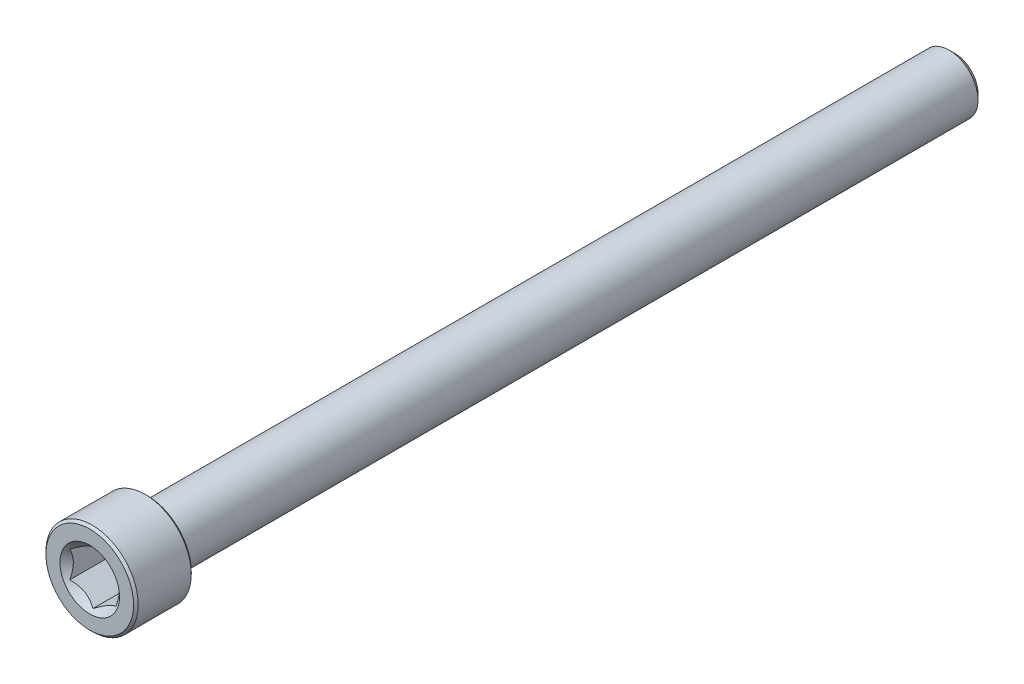
ISO-10303-21;
HEADER;
FILE_DESCRIPTION(('STEP AP214'),'2;1');
FILE_NAME('part.step','',(''),(''),'','','');
FILE_SCHEMA(('AUTOMOTIVE_DESIGN { 1 0 10303 214 1 1 1 1 }'));
ENDSEC;
DATA;
#1=APPLICATION_CONTEXT('core data for automotive mechanical design processes');
#2=APPLICATION_PROTOCOL_DEFINITION('international standard','automotive_design',2000,#1);
#3=PRODUCT_CONTEXT('',#1,'mechanical');
#4=PRODUCT('Part','Part','',(#3));
#5=PRODUCT_RELATED_PRODUCT_CATEGORY('part','',(#4));
#6=PRODUCT_DEFINITION_FORMATION('','',#4);
#7=PRODUCT_DEFINITION_CONTEXT('part definition',#1,'design');
#8=PRODUCT_DEFINITION('design','',#6,#7);
#9=PRODUCT_DEFINITION_SHAPE('','',#8);
#10=(LENGTH_UNIT() NAMED_UNIT(*) SI_UNIT(.MILLI.,.METRE.));
#11=(NAMED_UNIT(*) PLANE_ANGLE_UNIT() SI_UNIT($,.RADIAN.));
#12=(NAMED_UNIT(*) SI_UNIT($,.STERADIAN.) SOLID_ANGLE_UNIT());
#13=UNCERTAINTY_MEASURE_WITH_UNIT(LENGTH_MEASURE(1.E-05),#10,'distance_accuracy_value','');
#14=(GEOMETRIC_REPRESENTATION_CONTEXT(3) GLOBAL_UNCERTAINTY_ASSIGNED_CONTEXT((#13)) GLOBAL_UNIT_ASSIGNED_CONTEXT((#10,
#11,#12)) REPRESENTATION_CONTEXT('',''));
#15=CARTESIAN_POINT('',(0.,0.,0.));
#16=DIRECTION('',(0.,0.,1.));
#17=DIRECTION('',(1.,0.,0.));
#18=AXIS2_PLACEMENT_3D('',#15,#16,#17);
#19=CARTESIAN_POINT('',(2.,-1.154700538,-3.5));
#20=DIRECTION('',(1.,0.,0.));
#21=DIRECTION('',(0.,0.,1.));
#22=AXIS2_PLACEMENT_3D('',#19,#20,#21);
#23=PLANE('',#22);
#24=DIRECTION('',(0.,1.,0.));
#25=VECTOR('',#24,1.);
#26=CARTESIAN_POINT('',(2.,-2.309401077,-3.5));
#27=LINE('',#26,#25);
#28=CARTESIAN_POINT('',(2.,1.154700538,-3.5));
#29=VERTEX_POINT('',#28);
#30=CARTESIAN_POINT('',(2.,-1.15470053794893,-3.5));
#31=VERTEX_POINT('',#30);
#32=EDGE_CURVE('E159',#29,#31,#27,.F.);
#33=ORIENTED_EDGE('',*,*,#32,.T.);
#34=DIRECTION('',(0.,0.,1.));
#35=VECTOR('',#34,1.);
#36=CARTESIAN_POINT('',(2.,-1.1547005382376,-3.5));
#37=LINE('',#36,#35);
#38=CARTESIAN_POINT('',(2.00000000308098,-1.15470052267029,-0.269514051372486));
#39=VERTEX_POINT('',#38);
#40=EDGE_CURVE('E158',#39,#31,#37,.F.);
#41=ORIENTED_EDGE('',*,*,#40,.F.);
#42=CARTESIAN_POINT('',(2.,-1.15470051123793,-0.269514059670483));
#43=CARTESIAN_POINT('',(2.,-1.09141316260689,-0.300813622664889));
#44=CARTESIAN_POINT('',(2.,-1.02732561361497,-0.330613972957736));
#45=CARTESIAN_POINT('',(2.,-0.897288848890588,-0.386428363756532));
#46=CARTESIAN_POINT('',(2.,-0.831334343991557,-0.412430015535758));
#47=CARTESIAN_POINT('',(2.,-0.697433761794185,-0.459744148167775));
#48=CARTESIAN_POINT('',(2.00000000000001,-0.629480671385323,-0.481037113580133));
#49=CARTESIAN_POINT('',(1.99999999999999,-0.492081590441734,-0.517743621901352));
#50=CARTESIAN_POINT('',(1.99999999999997,-0.422637934909225,-0.533165739549636));
#51=CARTESIAN_POINT('',(1.99999999999997,-0.294338226574925,-0.555212898866587));
#52=CARTESIAN_POINT('',(1.99999999999999,-0.23566206566693,-0.562880186848599));
#53=CARTESIAN_POINT('',(2.00000000000001,-0.117989875900202,-0.573131677915132));
#54=CARTESIAN_POINT('',(2.,-0.0589948452951878,-0.575727118674964));
#55=CARTESIAN_POINT('',(2.,0.0590319978364044,-0.575727252211933));
#56=CARTESIAN_POINT('',(2.,0.118063810128711,-0.573128674928614));
#57=CARTESIAN_POINT('',(2.,0.23570432489238,-0.562873057258418));
#58=CARTESIAN_POINT('',(2.,0.294312839778573,-0.555213898490034));
#59=CARTESIAN_POINT('',(2.,0.410988060849133,-0.53517104010364));
#60=CARTESIAN_POINT('',(2.,0.46905095430725,-0.522765425585117));
#61=CARTESIAN_POINT('',(2.,0.58412672149976,-0.493768734727346));
#62=CARTESIAN_POINT('',(2.00000000000002,0.641139227564307,-0.477176221620323));
#63=CARTESIAN_POINT('',(2.00000000000002,0.776392762923852,-0.433094045798371));
#64=CARTESIAN_POINT('',(2.,0.854076447153317,-0.403893285807865));
#65=CARTESIAN_POINT('',(2.,0.968491928413275,-0.356123559122395));
#66=CARTESIAN_POINT('',(2.,1.00611484294823,-0.339621547608831));
#67=CARTESIAN_POINT('',(2.,1.08081059546299,-0.305424807709915));
#68=CARTESIAN_POINT('',(2.,1.11788349294676,-0.287730209510482));
#69=CARTESIAN_POINT('',(2.,1.15470054563611,-0.269514042648603));
#70=B_SPLINE_CURVE_WITH_KNOTS('',3,(#42,#43,#44,#45,#46,#47,#48,#49,#50,#51,#52,#53,#54,#55,#56,
#57,#58,#59,#60,#61,#62,#63,#64,#65,#66,#67,#68,#69),.UNSPECIFIED.,.F.,.F.,(4,2,2,2,2,2,2,2,2,2,
2,2,2,4),(0.,0.211871833424148,0.424419918805575,0.637833066220586,0.850933303443512,
1.02825559646968,1.20518454958216,1.38222492907141,1.55933946542912,1.73728182449737,
1.91528532914889,2.16395166893227,2.28718551539448,2.41040593104449),.UNSPECIFIED.);
#71=CARTESIAN_POINT('',(2.,1.15470054181806,-0.269514053601867));
#72=VERTEX_POINT('',#71);
#73=EDGE_CURVE('E58',#39,#72,#70,.T.);
#74=ORIENTED_EDGE('',*,*,#73,.T.);
#75=DIRECTION('',(0.,0.,1.));
#76=VECTOR('',#75,1.);
#77=CARTESIAN_POINT('',(2.,1.154700538,-3.5));
#78=LINE('',#77,#76);
#79=EDGE_CURVE('E145',#29,#72,#78,.T.);
#80=ORIENTED_EDGE('',*,*,#79,.F.);
#81=EDGE_LOOP('',(#33,#41,#74,#80));
#82=FACE_BOUND('',#81,.T.);
#83=ADVANCED_FACE('F53',(#82),#23,.F.);
#84=CARTESIAN_POINT('',(0.,-2.309401077,-0.250131148));
#85=DIRECTION('',(0.50000000031193,-0.866025403604346,0.));
#86=DIRECTION('',(0.866025403604346,0.50000000031193,0.));
#87=AXIS2_PLACEMENT_3D('',#84,#85,#86);
#88=PLANE('',#87);
#89=DIRECTION('',(-0.866025403604346,-0.50000000031193,0.));
#90=VECTOR('',#89,1.);
#91=CARTESIAN_POINT('',(1.99999999963638,-1.15470053787019,-3.5));
#92=LINE('',#91,#90);
#93=CARTESIAN_POINT('',(-4.70671904957264E-10,-2.30940107727174,-3.5));
#94=VERTEX_POINT('',#93);
#95=EDGE_CURVE('E146',#31,#94,#92,.T.);
#96=ORIENTED_EDGE('',*,*,#95,.T.);
#97=DIRECTION('',(0.,0.,-1.));
#98=VECTOR('',#97,1.);
#99=CARTESIAN_POINT('',(-6.47114344191555E-10,-2.30940107737361,-0.250131148));
#100=LINE('',#99,#98);
#101=CARTESIAN_POINT('',(1.4680532466432E-08,-2.30940107211196,-0.26951405083831));
#102=VERTEX_POINT('',#101);
#103=EDGE_CURVE('E193',#102,#94,#100,.T.);
#104=ORIENTED_EDGE('',*,*,#103,.F.);
#105=CARTESIAN_POINT('',(2.34410859076419E-08,-2.30940106346628,-0.26951405939491));
#106=CARTESIAN_POINT('',(0.0366667818223353,-2.28823150062695,-0.290461396144568));
#107=CARTESIAN_POINT('',(0.0736365423483632,-2.26688699941762,-0.310725715212649));
#108=CARTESIAN_POINT('',(0.148312433981132,-2.2237728532456,-0.349699316018672));
#109=CARTESIAN_POINT('',(0.186020376147532,-2.20200216266713,-0.36840396089146));
#110=CARTESIAN_POINT('',(0.262127072597705,-2.15806194094794,-0.403962117807034));
#111=CARTESIAN_POINT('',(0.300526423703779,-2.1358920652317,-0.420813931619529));
#112=CARTESIAN_POINT('',(0.397111609404862,-2.08012858222107,-0.460155148257436));
#113=CARTESIAN_POINT('',(0.455709741496556,-2.04629693485578,-0.481322288691599));
#114=CARTESIAN_POINT('',(0.574247774519945,-1.97785896952358,-0.517846630490531));
#115=CARTESIAN_POINT('',(0.634187151661863,-1.94325295396682,-0.533206059374245));
#116=CARTESIAN_POINT('',(0.746735494892844,-1.87827313765152,-0.555538144460678));
#117=CARTESIAN_POINT('',(0.799214788073673,-1.84797420358151,-0.563375573125499));
#118=CARTESIAN_POINT('',(0.904581401219032,-1.78714076106785,-0.573633038578399));
#119=CARTESIAN_POINT('',(0.957468756106172,-1.75660623246163,-0.576052606418792));
#120=CARTESIAN_POINT('',(1.06321795639198,-1.69555190315924,-0.575331177017809));
#121=CARTESIAN_POINT('',(1.11607979988058,-1.66503210356585,-0.572189813442251));
#122=CARTESIAN_POINT('',(1.22134434538901,-1.60425758982988,-0.560528571092439));
#123=CARTESIAN_POINT('',(1.2737470803736,-1.57400285665508,-0.552009081739217));
#124=CARTESIAN_POINT('',(1.38438824615751,-1.51012414975315,-0.528638999079536));
#125=CARTESIAN_POINT('',(1.44251987278194,-1.4765618394452,-0.513120247302543));
#126=CARTESIAN_POINT('',(1.55755500840878,-1.41014627286953,-0.476661296370748));
#127=CARTESIAN_POINT('',(1.61445677974814,-1.37729401984206,-0.45571390854881));
#128=CARTESIAN_POINT('',(1.72700816186304,-1.3123124490263,-0.4092740393445));
#129=CARTESIAN_POINT('',(1.78265384568009,-1.28018539846856,-0.383769067010784));
#130=CARTESIAN_POINT('',(1.89241626832334,-1.21681403415587,-0.329149843411634));
#131=CARTESIAN_POINT('',(1.94653697086662,-1.18556743194778,-0.300046266565295));
#132=CARTESIAN_POINT('',(2.00000000616196,-1.15470053410264,-0.269514043074489));
#133=B_SPLINE_CURVE_WITH_KNOTS('',3,(#105,#106,#107,#108,#109,#110,#111,#112,#113,#114,#115,
#116,#117,#118,#119,#120,#121,#122,#123,#124,#125,#126,#127,#128,#129,#130,#131,#132),
.UNSPECIFIED.,.F.,.F.,(4,2,2,2,2,2,2,2,2,2,2,2,2,4),(0.,0.141723316810714,0.283853972472535,
0.426113832082238,0.638582605696147,0.850969805105824,1.03405254816131,1.21715113749136,
1.40026178914749,1.5833591835902,1.7897767440648,1.99646905448806,2.20373678542241,
2.41040382536164),.UNSPECIFIED.);
#134=EDGE_CURVE('E160',#102,#39,#133,.T.);
#135=ORIENTED_EDGE('',*,*,#134,.T.);
#136=ORIENTED_EDGE('',*,*,#40,.T.);
#137=EDGE_LOOP('',(#96,#104,#135,#136));
#138=FACE_BOUND('',#137,.T.);
#139=ADVANCED_FACE('F173',(#138),#88,.F.);
#140=CARTESIAN_POINT('',(2.,1.154700538,-0.250131148));
#141=DIRECTION('',(0.50000000031193,0.866025403604346,0.));
#142=DIRECTION('',(-0.866025403604346,0.50000000031193,0.));
#143=AXIS2_PLACEMENT_3D('',#140,#141,#142);
#144=PLANE('',#143);
#145=DIRECTION('',(-0.866025403604346,0.50000000031193,0.));
#146=VECTOR('',#145,1.);
#147=CARTESIAN_POINT('',(2.,1.154700538,-3.5));
#148=LINE('',#147,#146);
#149=CARTESIAN_POINT('',(2.20671571293796E-10,2.30940107721234,-3.5));
#150=VERTEX_POINT('',#149);
#151=EDGE_CURVE('E151',#29,#150,#148,.T.);
#152=ORIENTED_EDGE('',*,*,#151,.F.);
#153=ORIENTED_EDGE('',*,*,#79,.T.);
#154=CARTESIAN_POINT('',(1.99999997655074,1.15470055153844,-0.269514059826263));
#155=CARTESIAN_POINT('',(1.96333321815987,1.17587011438333,-0.290461396560443));
#156=CARTESIAN_POINT('',(1.92636345762391,1.19721461559839,-0.310725715611674));
#157=CARTESIAN_POINT('',(1.85168756597079,1.24032876178216,-0.349699316381127));
#158=CARTESIAN_POINT('',(1.81397962379396,1.26209945236665,-0.368403961234182));
#159=CARTESIAN_POINT('',(1.73787292732279,1.30603967409796,-0.403962118107244));
#160=CARTESIAN_POINT('',(1.69947357620615,1.3282095498203,-0.420813931896956));
#161=CARTESIAN_POINT('',(1.60288839048328,1.38397303284352,-0.460155148471805));
#162=CARTESIAN_POINT('',(1.54429025838055,1.41780468021519,-0.481322288863874));
#163=CARTESIAN_POINT('',(1.42575222533703,1.48624264555898,-0.517846630571726));
#164=CARTESIAN_POINT('',(1.36581284818602,1.52084866112094,-0.533206059406455));
#165=CARTESIAN_POINT('',(1.25326450493319,1.58582847744886,-0.555538144398408));
#166=CARTESIAN_POINT('',(1.200785211739,1.61612741152663,-0.56337557301761));
#167=CARTESIAN_POINT('',(1.09541859857039,1.67696085405375,-0.573633038375843));
#168=CARTESIAN_POINT('',(1.04253124367336,1.70749538266566,-0.576052606167185));
#169=CARTESIAN_POINT('',(0.936782043370094,1.76854971197813,-0.57533117666743));
#170=CARTESIAN_POINT('',(0.883920199873925,1.79906951157589,-0.572189813041979));
#171=CARTESIAN_POINT('',(0.778655654353936,1.85984402531853,-0.560528570594069));
#172=CARTESIAN_POINT('',(0.726252919365357,1.89009875849562,-0.552009081192639));
#173=CARTESIAN_POINT('',(0.615611753599515,1.95397746538712,-0.528638998439564));
#174=CARTESIAN_POINT('',(0.55748012699711,1.98753977568237,-0.513120246620448));
#175=CARTESIAN_POINT('',(0.442444991415202,2.0539553422321,-0.476661295614484));
#176=CARTESIAN_POINT('',(0.385543220098744,2.08680759524635,-0.455713907760529));
#177=CARTESIAN_POINT('',(0.272991838033529,2.15178916603341,-0.409274038503187));
#178=CARTESIAN_POINT('',(0.217346154243124,2.18391621657577,-0.383769066148842));
#179=CARTESIAN_POINT('',(0.107583731651272,2.24728758085879,-0.329149842516337));
#180=CARTESIAN_POINT('',(0.0534630291327461,2.27853418305259,-0.300046265657223));
#181=CARTESIAN_POINT('',(-6.1388418220315E-09,2.30940108088401,-0.269514042156649));
#182=B_SPLINE_CURVE_WITH_KNOTS('',3,(#154,#155,#156,#157,#158,#159,#160,#161,#162,#163,#164,
#165,#166,#167,#168,#169,#170,#171,#172,#173,#174,#175,#176,#177,#178,#179,#180,#181),
.UNSPECIFIED.,.F.,.F.,(4,2,2,2,2,2,2,2,2,2,2,2,2,4),(0.,0.141723316819992,0.28385397249154,
0.426113832111052,0.638582605723244,0.850969805131258,1.03405254821484,1.21715113757313,
1.40026178926321,1.58335918373999,1.78977674416957,1.99646905454705,2.2037367854189,
2.41040382529713),.UNSPECIFIED.);
#183=CARTESIAN_POINT('',(-2.99586443435092E-09,2.30940107906941,-0.26951405335589));
#184=VERTEX_POINT('',#183);
#185=EDGE_CURVE('E133',#72,#184,#182,.T.);
#186=ORIENTED_EDGE('',*,*,#185,.T.);
#187=DIRECTION('',(0.,0.,-1.));
#188=VECTOR('',#187,1.);
#189=CARTESIAN_POINT('',(1.4711452542282E-10,2.30940107725481,-0.250131148));
#190=LINE('',#189,#188);
#191=EDGE_CURVE('E206',#150,#184,#190,.F.);
#192=ORIENTED_EDGE('',*,*,#191,.F.);
#193=EDGE_LOOP('',(#152,#153,#186,#192));
#194=FACE_BOUND('',#193,.T.);
#195=ADVANCED_FACE('F149',(#194),#144,.F.);
#196=CARTESIAN_POINT('',(-2.000000006,-1.154700535,-0.250131127));
#197=DIRECTION('',(-0.500000000161208,-0.866025403691365,0.));
#198=DIRECTION('',(0.866025403691365,-0.500000000161208,0.));
#199=AXIS2_PLACEMENT_3D('',#196,#197,#198);
#200=PLANE('',#199);
#201=DIRECTION('',(0.866025403691365,-0.500000000161208,0.));
#202=VECTOR('',#201,1.);
#203=CARTESIAN_POINT('',(-2.000000006,-1.154700535,-3.5));
#204=LINE('',#203,#202);
#205=CARTESIAN_POINT('',(-2.00000000010048,-1.15470053840609,-3.5));
#206=VERTEX_POINT('',#205);
#207=EDGE_CURVE('E202',#206,#94,#204,.T.);
#208=ORIENTED_EDGE('',*,*,#207,.F.);
#209=DIRECTION('',(0.,0.,-1.));
#210=VECTOR('',#209,1.);
#211=CARTESIAN_POINT('',(-2.00000000020096,-1.15470053834808,-0.250131127));
#212=LINE('',#211,#210);
#213=CARTESIAN_POINT('',(-2.00000000394818,-1.15470053618462,-0.269514042740437));
#214=VERTEX_POINT('',#213);
#215=EDGE_CURVE('E201',#214,#206,#212,.T.);
#216=ORIENTED_EDGE('',*,*,#215,.F.);
#217=CARTESIAN_POINT('',(-2.00000000769541,-1.15470053402116,-0.269514041800493));
#218=CARTESIAN_POINT('',(-1.9633332495226,-1.17587009673164,-0.290461378897032));
#219=CARTESIAN_POINT('',(-1.9263634892119,-1.19721459780807,-0.310725698341832));
#220=CARTESIAN_POINT('',(-1.85168759802394,-1.24032874370595,-0.349699299969472));
#221=CARTESIAN_POINT('',(-1.81397965608712,-1.26209943414312,-0.368403945287519));
#222=CARTESIAN_POINT('',(-1.73787296010314,-1.30603965557549,-0.403962103172786));
#223=CARTESIAN_POINT('',(-1.69947360923369,-1.3282095311462,-0.420813917509831));
#224=CARTESIAN_POINT('',(-1.60288842403816,-1.38397301384255,-0.46015513559925));
#225=CARTESIAN_POINT('',(-1.54429029221302,-1.41780466104035,-0.481322277007332));
#226=CARTESIAN_POINT('',(-1.42575225968184,-1.48624262606084,-0.517846620941812));
#227=CARTESIAN_POINT('',(-1.36581288276558,-1.52084864147336,-0.533206050987076));
#228=CARTESIAN_POINT('',(-1.25326453988715,-1.585828457559,-0.55553813837825));
#229=CARTESIAN_POINT('',(-1.20078524684429,-1.61612739153722,-0.563375568167468));
#230=CARTESIAN_POINT('',(-1.09541863388945,-1.67696083391647,-0.573633035936899));
#231=CARTESIAN_POINT('',(-1.04253127905485,-1.70749536248007,-0.576052604969535));
#232=CARTESIAN_POINT('',(-0.936782078804225,-1.7685496917376,-0.575331177953416));
#233=CARTESIAN_POINT('',(-0.883920235298245,-1.79906949132876,-0.5721898155732));
#234=CARTESIAN_POINT('',(-0.778655689670982,-1.85984400510891,-0.560528575552718));
#235=CARTESIAN_POINT('',(-0.726252954584936,-1.89009873833012,-0.552009087333614));
#236=CARTESIAN_POINT('',(-0.615611785657401,-1.95397744702134,-0.528639006364149));
#237=CARTESIAN_POINT('',(-0.557480156031052,-1.98753975904898,-0.513120254822423));
#238=CARTESIAN_POINT('',(-0.44244501448489,-2.05395532901547,-0.476661303705195));
#239=CARTESIAN_POINT('',(-0.385543240228545,-2.08680758371386,-0.455713915460509));
#240=CARTESIAN_POINT('',(-0.272991852293287,-2.15178915786389,-0.40927404484587));
#241=CARTESIAN_POINT('',(-0.217346165576066,-2.18391621008313,-0.383769071514073));
#242=CARTESIAN_POINT('',(-0.107583737305808,-2.24728757761911,-0.329149845527793));
#243=CARTESIAN_POINT('',(-0.0534630320346568,-2.27853418138957,-0.300046267295246));
#244=CARTESIAN_POINT('',(5.91997696523794E-09,-2.30940108075765,-0.269514042281709));
#245=B_SPLINE_CURVE_WITH_KNOTS('',3,(#217,#218,#219,#220,#221,#222,#223,#224,#225,#226,#227,
#228,#229,#230,#231,#232,#233,#234,#235,#236,#237,#238,#239,#240,#241,#242,#243,#244),
.UNSPECIFIED.,.F.,.F.,(4,2,2,2,2,2,2,2,2,2,2,2,2,4),(0.,0.141723316612889,0.283853972061864,
0.426113831455091,0.638582605054632,0.850969804450178,1.0340525474533,1.21715113672758,
1.40026178823836,1.58335918253144,1.78977675290602,1.99646907328744,2.20373681462456,
2.41040386484257),.UNSPECIFIED.);
#246=EDGE_CURVE('E155',#214,#102,#245,.T.);
#247=ORIENTED_EDGE('',*,*,#246,.T.);
#248=ORIENTED_EDGE('',*,*,#103,.T.);
#249=EDGE_LOOP('',(#208,#216,#247,#248));
#250=FACE_BOUND('',#249,.T.);
#251=ADVANCED_FACE('F182',(#250),#200,.F.);
#252=CARTESIAN_POINT('',(-2.,-2.309401077,-3.5));
#253=DIRECTION('',(0.,0.,-1.));
#254=DIRECTION('',(1.,0.,0.));
#255=AXIS2_PLACEMENT_3D('',#252,#253,#254);
#256=PLANE('',#255);
#257=DIRECTION('',(0.866025403604346,0.50000000031193,0.));
#258=VECTOR('',#257,1.);
#259=CARTESIAN_POINT('',(-2.000000015,1.154700529,-3.5));
#260=LINE('',#259,#258);
#261=CARTESIAN_POINT('',(-1.99999999992644,1.15470053770272,-3.5));
#262=VERTEX_POINT('',#261);
#263=EDGE_CURVE('E210',#262,#150,#260,.T.);
#264=ORIENTED_EDGE('',*,*,#263,.F.);
#265=DIRECTION('',(0.,1.,0.));
#266=VECTOR('',#265,1.);
#267=CARTESIAN_POINT('',(-2.,-2.309401077,-3.5));
#268=LINE('',#267,#266);
#269=EDGE_CURVE('E205',#206,#262,#268,.T.);
#270=ORIENTED_EDGE('',*,*,#269,.F.);
#271=ORIENTED_EDGE('',*,*,#207,.T.);
#272=ORIENTED_EDGE('',*,*,#95,.F.);
#273=ORIENTED_EDGE('',*,*,#32,.F.);
#274=ORIENTED_EDGE('',*,*,#151,.T.);
#275=EDGE_LOOP('',(#264,#270,#271,#272,#273,#274));
#276=FACE_BOUND('',#275,.T.);
#277=ADVANCED_FACE('F227',(#276),#256,.F.);
#278=CARTESIAN_POINT('',(0.,2.309401077,-0.250131148));
#279=DIRECTION('',(-0.50000000031193,0.866025403604346,0.));
#280=DIRECTION('',(-0.866025403604346,-0.50000000031193,0.));
#281=AXIS2_PLACEMENT_3D('',#278,#279,#280);
#282=PLANE('',#281);
#283=ORIENTED_EDGE('',*,*,#263,.T.);
#284=ORIENTED_EDGE('',*,*,#191,.T.);
#285=CARTESIAN_POINT('',(-2.36027140998086E-08,2.30940106337297,-0.269514059487264));
#286=CARTESIAN_POINT('',(-0.0366667819851753,2.28823150053293,-0.290461396235029));
#287=CARTESIAN_POINT('',(-0.0736365425124397,2.26688699932289,-0.310725715301092));
#288=CARTESIAN_POINT('',(-0.148312434147754,2.2237728531494,-0.349699316102727));
#289=CARTESIAN_POINT('',(-0.186020376315464,2.20200216257018,-0.368403960973143));
#290=CARTESIAN_POINT('',(-0.262127072768308,2.15806194084944,-0.403962117883501));
#291=CARTESIAN_POINT('',(-0.300526423875744,2.13589206513242,-0.420813931693152));
#292=CARTESIAN_POINT('',(-0.39711160957959,2.08012858212019,-0.460155148323199));
#293=CARTESIAN_POINT('',(-0.455709741672657,2.04629693475411,-0.481322288752139));
#294=CARTESIAN_POINT('',(-0.574247774698599,1.97785896942043,-0.517846630539498));
#295=CARTESIAN_POINT('',(-0.634187151841696,1.94325295386299,-0.533206059416862));
#296=CARTESIAN_POINT('',(-0.74673549507459,1.87827313754659,-0.555538144490762));
#297=CARTESIAN_POINT('',(-0.799214788256216,1.84797420347612,-0.563375573149487));
#298=CARTESIAN_POINT('',(-0.904581401402707,1.7871407609618,-0.573633038589895));
#299=CARTESIAN_POINT('',(-0.957468756290181,1.75660623235539,-0.576052606423893));
#300=CARTESIAN_POINT('',(-1.06321795657637,1.69555190305278,-0.575331177010083));
#301=CARTESIAN_POINT('',(-1.11607980006501,1.66503210345937,-0.572189813428072));
#302=CARTESIAN_POINT('',(-1.22134434557307,1.60425758972361,-0.560528571065701));
#303=CARTESIAN_POINT('',(-1.27374708055725,1.57400285654906,-0.552009081706375));
#304=CARTESIAN_POINT('',(-1.38438824633938,1.51012414964816,-0.528638999034415));
#305=CARTESIAN_POINT('',(-1.44251987296239,1.47656183934101,-0.513120247251383));
#306=CARTESIAN_POINT('',(-1.55755500858622,1.41014627276709,-0.476661296308504));
#307=CARTESIAN_POINT('',(-1.61445677992398,1.37729401974054,-0.455713908481522));
#308=CARTESIAN_POINT('',(-1.72700816203507,1.31231244892698,-0.409274039268296));
#309=CARTESIAN_POINT('',(-1.78265384584995,1.28018539837049,-0.383769066930757));
#310=CARTESIAN_POINT('',(-1.89241626848897,1.21681403406024,-0.329149843324834));
#311=CARTESIAN_POINT('',(-1.9465369710302,1.18556743185334,-0.300046266475541));
#312=CARTESIAN_POINT('',(-2.00000000632359,1.15470053400933,-0.269514042982134));
#313=B_SPLINE_CURVE_WITH_KNOTS('',3,(#285,#286,#287,#288,#289,#290,#291,#292,#293,#294,#295,
#296,#297,#298,#299,#300,#301,#302,#303,#304,#305,#306,#307,#308,#309,#310,#311,#312),
.UNSPECIFIED.,.F.,.F.,(4,2,2,2,2,2,2,2,2,2,2,2,2,4),(0.,0.141723316811969,0.283853972475134,
0.426113832086201,0.638582605699897,0.850969805109349,1.0340525481652,1.21715113749563,
1.40026178915291,1.58335918359679,1.78977674407081,1.99646905449342,2.20373678542504,
2.41040382536165),.UNSPECIFIED.);
#314=CARTESIAN_POINT('',(-2.00000000308824,1.15470053587726,-0.269514053080863));
#315=VERTEX_POINT('',#314);
#316=EDGE_CURVE('E141',#184,#315,#313,.T.);
#317=ORIENTED_EDGE('',*,*,#316,.T.);
#318=DIRECTION('',(0.,0.,-1.));
#319=VECTOR('',#318,1.);
#320=CARTESIAN_POINT('',(-1.99999999985289,1.15470053774519,-0.250131148));
#321=LINE('',#320,#319);
#322=EDGE_CURVE('E208',#262,#315,#321,.F.);
#323=ORIENTED_EDGE('',*,*,#322,.F.);
#324=EDGE_LOOP('',(#283,#284,#317,#323));
#325=FACE_BOUND('',#324,.T.);
#326=ADVANCED_FACE('F222',(#325),#282,.F.);
#327=CARTESIAN_POINT('',(-2.,1.154700538,-0.250131127));
#328=DIRECTION('',(-1.,0.,0.));
#329=DIRECTION('',(0.,-1.,0.));
#330=AXIS2_PLACEMENT_3D('',#327,#328,#329);
#331=PLANE('',#330);
#332=ORIENTED_EDGE('',*,*,#269,.T.);
#333=ORIENTED_EDGE('',*,*,#322,.T.);
#334=CARTESIAN_POINT('',(-2.,1.1547005109852,-0.269514059795543));
#335=CARTESIAN_POINT('',(-2.,1.09141316234718,-0.300813622788192));
#336=CARTESIAN_POINT('',(-2.,1.02732561334804,-0.330613973078675));
#337=CARTESIAN_POINT('',(-2.,0.897288848608815,-0.386428363870992));
#338=CARTESIAN_POINT('',(-2.,0.831334343702156,-0.412430015646095));
#339=CARTESIAN_POINT('',(-2.,0.697433761498961,-0.459744148264097));
#340=CARTESIAN_POINT('',(-2.00000000000001,0.629480671092152,-0.481037113667253));
#341=CARTESIAN_POINT('',(-1.99999999999999,0.492081590153311,-0.517743621969554));
#342=CARTESIAN_POINT('',(-1.99999999999997,0.422637934623495,-0.533165739608122));
#343=CARTESIAN_POINT('',(-1.99999999999997,0.294338226217761,-0.555212898920149));
#344=CARTESIAN_POINT('',(-1.99999999999999,0.235662065234454,-0.56288018690081));
#345=CARTESIAN_POINT('',(-2.00000000000001,0.117989875312741,-0.573131677951624));
#346=CARTESIAN_POINT('',(-2.,0.0589948446280198,-0.575727118696725));
#347=CARTESIAN_POINT('',(-2.,-0.0590319986024294,-0.575727252190158));
#348=CARTESIAN_POINT('',(-2.,-0.118063810913885,-0.573128674883185));
#349=CARTESIAN_POINT('',(-2.,-0.235704325713886,-0.562873057163553));
#350=CARTESIAN_POINT('',(-2.,-0.294312840617258,-0.555213898369371));
#351=CARTESIAN_POINT('',(-2.,-0.410988061705339,-0.535171039932846));
#352=CARTESIAN_POINT('',(-2.,-0.469050955163994,-0.522765425391171));
#353=CARTESIAN_POINT('',(-2.,-0.58412672235625,-0.493768734489385));
#354=CARTESIAN_POINT('',(-2.00000000000002,-0.641139228420022,-0.477176221361558));
#355=CARTESIAN_POINT('',(-2.00000000000002,-0.776392758038312,-0.433094047362535));
#356=CARTESIAN_POINT('',(-2.,-0.854076436692495,-0.403893289727786));
#357=CARTESIAN_POINT('',(-2.,-0.968491909892792,-0.356123567076752));
#358=CARTESIAN_POINT('',(-2.,-1.00611482181393,-0.339621556978416));
#359=CARTESIAN_POINT('',(-2.,-1.08081056917859,-0.305424820048441));
#360=CARTESIAN_POINT('',(-2.,-1.11788346412602,-0.287730223402595));
#361=CARTESIAN_POINT('',(-2.,-1.15470051431106,-0.269514058149751));
#362=B_SPLINE_CURVE_WITH_KNOTS('',3,(#334,#335,#336,#337,#338,#339,#340,#341,#342,#343,#344,
#345,#346,#347,#348,#349,#350,#351,#352,#353,#354,#355,#356,#357,#358,#359,#360,#361),
.UNSPECIFIED.,.F.,.F.,(4,2,2,2,2,2,2,2,2,2,2,2,2,4),(0.,0.211871833440665,0.424419918838733,
0.637833066239533,0.850933303448268,1.02825559669709,1.20518455004553,1.38222492959516,
1.55933946601383,1.73728182509864,1.91528532976428,2.16395165147123,2.2871854890489,
2.41040589582687),.UNSPECIFIED.);
#363=EDGE_CURVE('E196',#315,#214,#362,.T.);
#364=ORIENTED_EDGE('',*,*,#363,.T.);
#365=ORIENTED_EDGE('',*,*,#215,.T.);
#366=EDGE_LOOP('',(#332,#333,#364,#365));
#367=FACE_BOUND('',#366,.T.);
#368=ADVANCED_FACE('F226',(#367),#331,.F.);
#369=CARTESIAN_POINT('',(-1.983860223,0.,-0.591700665));
#370=CARTESIAN_POINT('',(-2.581720992,0.,0.));
#371=(BOUNDED_CURVE() B_SPLINE_CURVE(1,(#369,#370),.UNSPECIFIED.,.F.,
.F.) B_SPLINE_CURVE_WITH_KNOTS((2,2),(0.,1.),
.UNSPECIFIED.) CURVE() GEOMETRIC_REPRESENTATION_ITEM() RATIONAL_B_SPLINE_CURVE((1.,1.)) REPRESENTATION_ITEM(''));
#372=CARTESIAN_POINT('',(0.,0.,-1000.));
#373=DIRECTION('',(0.,0.,1.));
#374=AXIS1_PLACEMENT('',#372,#373);
#375=SURFACE_OF_REVOLUTION('',#371,#374);
#376=ORIENTED_EDGE('',*,*,#134,.F.);
#377=ORIENTED_EDGE('',*,*,#246,.F.);
#378=ORIENTED_EDGE('',*,*,#363,.F.);
#379=ORIENTED_EDGE('',*,*,#316,.F.);
#380=ORIENTED_EDGE('',*,*,#185,.F.);
#381=ORIENTED_EDGE('',*,*,#73,.F.);
#382=EDGE_LOOP('',(#376,#377,#378,#379,#380,#381));
#383=FACE_BOUND('',#382,.T.);
#384=CARTESIAN_POINT('',(0.,0.,0.));
#385=DIRECTION('',(0.,0.,-1.));
#386=DIRECTION('',(-1.,0.,0.));
#387=AXIS2_PLACEMENT_3D('',#384,#385,#386);
#388=CIRCLE('',#387,2.581720992);
#389=CARTESIAN_POINT('',(-2.581720992,0.,0.));
#390=VERTEX_POINT('',#389);
#391=EDGE_CURVE('E239',#390,#390,#388,.F.);
#392=ORIENTED_EDGE('',*,*,#391,.T.);
#393=EDGE_LOOP('',(#392));
#394=FACE_BOUND('',#393,.T.);
#395=ADVANCED_FACE('F136',(#383,#394),#375,.F.);
#396=CARTESIAN_POINT('',(3.8456,-3.8456,0.));
#397=DIRECTION('',(0.,0.,1.));
#398=DIRECTION('',(-1.,0.,0.));
#399=AXIS2_PLACEMENT_3D('',#396,#397,#398);
#400=PLANE('',#399);
#401=ORIENTED_EDGE('',*,*,#391,.F.);
#402=EDGE_LOOP('',(#401));
#403=FACE_BOUND('',#402,.T.);
#404=CARTESIAN_POINT('',(0.,0.,0.));
#405=DIRECTION('',(0.,0.,1.));
#406=DIRECTION('',(1.,0.,0.));
#407=AXIS2_PLACEMENT_3D('',#404,#405,#406);
#408=CIRCLE('',#407,3.8);
#409=CARTESIAN_POINT('',(3.8,0.,0.));
#410=VERTEX_POINT('',#409);
#411=EDGE_CURVE('E627',#410,#410,#408,.F.);
#412=ORIENTED_EDGE('',*,*,#411,.F.);
#413=EDGE_LOOP('',(#412));
#414=FACE_BOUND('',#413,.T.);
#415=ADVANCED_FACE('F232',(#403,#414),#400,.T.);
#416=CARTESIAN_POINT('',(3.8,0.,0.));
#417=CARTESIAN_POINT('',(4.,0.,-0.2));
#418=(BOUNDED_CURVE() B_SPLINE_CURVE(1,(#416,#417),.UNSPECIFIED.,.F.,
.F.) B_SPLINE_CURVE_WITH_KNOTS((2,2),(0.,1.),
.UNSPECIFIED.) CURVE() GEOMETRIC_REPRESENTATION_ITEM() RATIONAL_B_SPLINE_CURVE((1.,1.)) REPRESENTATION_ITEM(''));
#419=CARTESIAN_POINT('',(0.,0.,999.8));
#420=DIRECTION('',(0.,0.,-1.));
#421=AXIS1_PLACEMENT('',#419,#420);
#422=SURFACE_OF_REVOLUTION('',#418,#421);
#423=CARTESIAN_POINT('',(0.,0.,-0.199999999999978));
#424=DIRECTION('',(0.,0.,1.));
#425=DIRECTION('',(1.,0.,0.));
#426=AXIS2_PLACEMENT_3D('',#423,#424,#425);
#427=CIRCLE('',#426,4.);
#428=CARTESIAN_POINT('',(4.,0.,-0.2));
#429=VERTEX_POINT('',#428);
#430=EDGE_CURVE('E625',#429,#429,#427,.F.);
#431=ORIENTED_EDGE('',*,*,#430,.F.);
#432=EDGE_LOOP('',(#431));
#433=FACE_BOUND('',#432,.T.);
#434=ORIENTED_EDGE('',*,*,#411,.T.);
#435=EDGE_LOOP('',(#434));
#436=FACE_BOUND('',#435,.T.);
#437=ADVANCED_FACE('F308',(#433,#436),#422,.T.);
#438=CARTESIAN_POINT('',(4.,0.,-0.2));
#439=CARTESIAN_POINT('',(4.,0.,-4.8));
#440=(BOUNDED_CURVE() B_SPLINE_CURVE(1,(#438,#439),.UNSPECIFIED.,.F.,
.F.) B_SPLINE_CURVE_WITH_KNOTS((2,2),(0.,1.),
.UNSPECIFIED.) CURVE() GEOMETRIC_REPRESENTATION_ITEM() RATIONAL_B_SPLINE_CURVE((1.,1.)) REPRESENTATION_ITEM(''));
#441=CARTESIAN_POINT('',(0.,0.,0.));
#442=DIRECTION('',(0.,0.,-1.));
#443=AXIS1_PLACEMENT('',#441,#442);
#444=SURFACE_OF_REVOLUTION('',#440,#443);
#445=CARTESIAN_POINT('',(0.,0.,-4.8));
#446=DIRECTION('',(0.,0.,1.));
#447=DIRECTION('',(1.,0.,0.));
#448=AXIS2_PLACEMENT_3D('',#445,#446,#447);
#449=CIRCLE('',#448,4.);
#450=CARTESIAN_POINT('',(-4.,-1.17958645141942E-09,-4.8));
#451=VERTEX_POINT('',#450);
#452=CARTESIAN_POINT('',(4.,-8.20413714061325E-10,-4.8));
#453=VERTEX_POINT('',#452);
#454=EDGE_CURVE('E614',#451,#453,#449,.F.);
#455=ORIENTED_EDGE('',*,*,#454,.F.);
#456=CARTESIAN_POINT('',(0.,0.,-4.8));
#457=DIRECTION('',(0.,0.,1.));
#458=DIRECTION('',(1.,0.,0.));
#459=AXIS2_PLACEMENT_3D('',#456,#457,#458);
#460=CIRCLE('',#459,4.);
#461=EDGE_CURVE('E619',#453,#451,#460,.F.);
#462=ORIENTED_EDGE('',*,*,#461,.F.);
#463=EDGE_LOOP('',(#455,#462));
#464=FACE_BOUND('',#463,.T.);
#465=ORIENTED_EDGE('',*,*,#430,.T.);
#466=EDGE_LOOP('',(#465));
#467=FACE_BOUND('',#466,.T.);
#468=ADVANCED_FACE('F318',(#464,#467),#444,.T.);
#469=CARTESIAN_POINT('',(2.024,-2.024,-75.));
#470=DIRECTION('',(0.,0.,1.));
#471=DIRECTION('',(-1.,0.,0.));
#472=AXIS2_PLACEMENT_3D('',#469,#470,#471);
#473=PLANE('',#472);
#474=CARTESIAN_POINT('',(0.,0.,-75.));
#475=DIRECTION('',(0.,0.,-1.));
#476=DIRECTION('',(-1.,0.,0.));
#477=AXIS2_PLACEMENT_3D('',#474,#475,#476);
#478=CIRCLE('',#477,2.);
#479=CARTESIAN_POINT('',(-2.00000000000002,-2.39448491582417E-10,-75.));
#480=VERTEX_POINT('',#479);
#481=CARTESIAN_POINT('',(2.00000000000002,-6.83678095095289E-10,-75.));
#482=VERTEX_POINT('',#481);
#483=EDGE_CURVE('E622',#480,#482,#478,.F.);
#484=ORIENTED_EDGE('',*,*,#483,.F.);
#485=CARTESIAN_POINT('',(0.,0.,-75.));
#486=DIRECTION('',(0.,0.,-1.));
#487=DIRECTION('',(-1.,0.,0.));
#488=AXIS2_PLACEMENT_3D('',#485,#486,#487);
#489=CIRCLE('',#488,2.00000000000001);
#490=EDGE_CURVE('E604',#482,#480,#489,.F.);
#491=ORIENTED_EDGE('',*,*,#490,.F.);
#492=EDGE_LOOP('',(#484,#491));
#493=FACE_BOUND('',#492,.T.);
#494=ADVANCED_FACE('F328',(#493),#473,.F.);
#495=CARTESIAN_POINT('',(-2.,0.,-75.));
#496=CARTESIAN_POINT('',(-2.5,0.,-74.5));
#497=(BOUNDED_CURVE() B_SPLINE_CURVE(1,(#495,#496),.UNSPECIFIED.,.F.,
.F.) B_SPLINE_CURVE_WITH_KNOTS((2,2),(0.,1.),
.UNSPECIFIED.) CURVE() GEOMETRIC_REPRESENTATION_ITEM() RATIONAL_B_SPLINE_CURVE((1.,1.)) REPRESENTATION_ITEM(''));
#498=CARTESIAN_POINT('',(0.,0.,-1074.5));
#499=DIRECTION('',(0.,0.,1.));
#500=AXIS1_PLACEMENT('',#498,#499);
#501=SURFACE_OF_REVOLUTION('',#497,#500);
#502=ORIENTED_EDGE('',*,*,#483,.T.);
#503=DIRECTION('',(-0.707106781186547,2.90060050295602E-10,-0.707106781186548));
#504=VECTOR('',#503,1.);
#505=CARTESIAN_POINT('',(2.25,-9.2296542831899E-10,-74.75));
#506=LINE('',#505,#504);
#507=CARTESIAN_POINT('',(2.5,-7.37241532137136E-10,-74.5));
#508=VERTEX_POINT('',#507);
#509=EDGE_CURVE('E607',#508,#482,#506,.T.);
#510=ORIENTED_EDGE('',*,*,#509,.F.);
#511=CARTESIAN_POINT('',(0.,0.,-74.5));
#512=DIRECTION('',(0.,0.,-1.));
#513=DIRECTION('',(-1.,0.,0.));
#514=AXIS2_PLACEMENT_3D('',#511,#512,#513);
#515=CIRCLE('',#514,2.5);
#516=CARTESIAN_POINT('',(-2.5,-5.12758571288328E-10,-74.5));
#517=VERTEX_POINT('',#516);
#518=EDGE_CURVE('E602',#517,#508,#515,.F.);
#519=ORIENTED_EDGE('',*,*,#518,.F.);
#520=DIRECTION('',(-0.707106781186547,-1.26986739101621E-10,0.707106781186548));
#521=VECTOR('',#520,1.);
#522=CARTESIAN_POINT('',(-2.25,-4.04069329527854E-10,-74.75));
#523=LINE('',#522,#521);
#524=EDGE_CURVE('E609',#480,#517,#523,.T.);
#525=ORIENTED_EDGE('',*,*,#524,.F.);
#526=EDGE_LOOP('',(#502,#510,#519,#525));
#527=FACE_BOUND('',#526,.T.);
#528=ADVANCED_FACE('F339',(#527),#501,.T.);
#529=CARTESIAN_POINT('',(-3.8,0.,-5.));
#530=CARTESIAN_POINT('',(-4.,0.,-4.8));
#531=(BOUNDED_CURVE() B_SPLINE_CURVE(1,(#529,#530),.UNSPECIFIED.,.F.,
.F.) B_SPLINE_CURVE_WITH_KNOTS((2,2),(0.,1.00000000000023),
.UNSPECIFIED.) CURVE() GEOMETRIC_REPRESENTATION_ITEM() RATIONAL_B_SPLINE_CURVE((1.,1.)) REPRESENTATION_ITEM(''));
#532=CARTESIAN_POINT('',(0.,0.,-1004.8));
#533=DIRECTION('',(0.,0.,1.));
#534=AXIS1_PLACEMENT('',#532,#533);
#535=SURFACE_OF_REVOLUTION('',#531,#534);
#536=CARTESIAN_POINT('',(0.,0.,-5.));
#537=DIRECTION('',(0.,0.,-1.));
#538=DIRECTION('',(-1.,0.,0.));
#539=AXIS2_PLACEMENT_3D('',#536,#537,#538);
#540=CIRCLE('',#539,3.8);
#541=CARTESIAN_POINT('',(3.8,-1.2989883805417E-09,-5.));
#542=VERTEX_POINT('',#541);
#543=CARTESIAN_POINT('',(-3.8,-4.54952134067583E-10,-5.));
#544=VERTEX_POINT('',#543);
#545=EDGE_CURVE('E599',#542,#544,#540,.T.);
#546=ORIENTED_EDGE('',*,*,#545,.F.);
#547=DIRECTION('',(-0.707106781186547,2.90060050295602E-10,-0.707106781186548));
#548=VECTOR('',#547,1.);
#549=CARTESIAN_POINT('',(3.9,-1.59980674241958E-09,-4.9));
#550=LINE('',#549,#548);
#551=EDGE_CURVE('E611',#453,#542,#550,.T.);
#552=ORIENTED_EDGE('',*,*,#551,.F.);
#553=ORIENTED_EDGE('',*,*,#461,.T.);
#554=DIRECTION('',(-0.707106781186547,-1.26986739101621E-10,0.707106781186548));
#555=VECTOR('',#554,1.);
#556=CARTESIAN_POINT('',(-3.9,-7.00386837848281E-10,-4.9));
#557=LINE('',#556,#555);
#558=EDGE_CURVE('E617',#544,#451,#557,.T.);
#559=ORIENTED_EDGE('',*,*,#558,.F.);
#560=EDGE_LOOP('',(#546,#552,#553,#559));
#561=FACE_BOUND('',#560,.T.);
#562=ADVANCED_FACE('F349',(#561),#535,.T.);
#563=CARTESIAN_POINT('',(-3.79985857864376,0.,-5.00014142135624));
#564=CARTESIAN_POINT('',(-3.8,0.,-5.));
#565=CARTESIAN_POINT('',(-4.,0.,-4.8));
#566=(BOUNDED_CURVE() B_SPLINE_CURVE(1,(#563,#564,#565),.UNSPECIFIED.,.F.,
.F.) B_SPLINE_CURVE_WITH_KNOTS((2,1,2),(-0.000707075757313215,3.10019516407802E-08,1.),
.UNSPECIFIED.) CURVE() GEOMETRIC_REPRESENTATION_ITEM() RATIONAL_B_SPLINE_CURVE((1.,1.,1.)) REPRESENTATION_ITEM(''));
#567=CARTESIAN_POINT('',(0.,0.,-1004.8));
#568=DIRECTION('',(0.,0.,1.));
#569=AXIS1_PLACEMENT('',#567,#568);
#570=SURFACE_OF_REVOLUTION('',#566,#569);
#571=ORIENTED_EDGE('',*,*,#551,.T.);
#572=CARTESIAN_POINT('',(0.,0.,-5.));
#573=DIRECTION('',(0.,0.,-1.));
#574=DIRECTION('',(-1.,0.,0.));
#575=AXIS2_PLACEMENT_3D('',#572,#573,#574);
#576=CIRCLE('',#575,3.8);
#577=EDGE_CURVE('E597',#544,#542,#576,.T.);
#578=ORIENTED_EDGE('',*,*,#577,.F.);
#579=ORIENTED_EDGE('',*,*,#558,.T.);
#580=ORIENTED_EDGE('',*,*,#454,.T.);
#581=EDGE_LOOP('',(#571,#578,#579,#580));
#582=FACE_BOUND('',#581,.T.);
#583=ADVANCED_FACE('F360',(#582),#570,.T.);
#584=CARTESIAN_POINT('',(-1.99985857864377,0.,-75.0001414213562));
#585=CARTESIAN_POINT('',(-2.,0.,-75.));
#586=CARTESIAN_POINT('',(-2.5,0.,-74.5));
#587=(BOUNDED_CURVE() B_SPLINE_CURVE(1,(#584,#585,#586),.UNSPECIFIED.,.F.,
.F.) B_SPLINE_CURVE_WITH_KNOTS((2,1,2),(-0.000282842621442565,9.10063135961536E-11,1.),
.UNSPECIFIED.) CURVE() GEOMETRIC_REPRESENTATION_ITEM() RATIONAL_B_SPLINE_CURVE((1.,1.,1.)) REPRESENTATION_ITEM(''));
#588=CARTESIAN_POINT('',(0.,0.,-1074.5));
#589=DIRECTION('',(0.,0.,1.));
#590=AXIS1_PLACEMENT('',#588,#589);
#591=SURFACE_OF_REVOLUTION('',#587,#590);
#592=ORIENTED_EDGE('',*,*,#509,.T.);
#593=ORIENTED_EDGE('',*,*,#490,.T.);
#594=ORIENTED_EDGE('',*,*,#524,.T.);
#595=CARTESIAN_POINT('',(0.,0.,-74.5));
#596=DIRECTION('',(0.,0.,-1.));
#597=DIRECTION('',(-1.,0.,0.));
#598=AXIS2_PLACEMENT_3D('',#595,#596,#597);
#599=CIRCLE('',#598,2.5);
#600=EDGE_CURVE('E70',#508,#517,#599,.F.);
#601=ORIENTED_EDGE('',*,*,#600,.F.);
#602=EDGE_LOOP('',(#592,#593,#594,#601));
#603=FACE_BOUND('',#602,.T.);
#604=ADVANCED_FACE('F371',(#603),#591,.T.);
#605=CARTESIAN_POINT('',(3.8456,-3.8456,-5.));
#606=DIRECTION('',(0.,0.,1.));
#607=DIRECTION('',(-1.,0.,0.));
#608=AXIS2_PLACEMENT_3D('',#605,#606,#607);
#609=PLANE('',#608);
#610=CARTESIAN_POINT('',(-2.5,-6.83678363071545E-10,-5.));
#611=CARTESIAN_POINT('',(-2.49999957938051,0.0701921593122,-5.));
#612=CARTESIAN_POINT('',(-2.49704119346556,0.140397219014432,-5.));
#613=CARTESIAN_POINT('',(-2.48522688344576,0.280322178508838,-5.));
#614=CARTESIAN_POINT('',(-2.47636921820289,0.350041928924395,-5.));
#615=CARTESIAN_POINT('',(-2.45279620047681,0.48860476584359,-5.));
#616=CARTESIAN_POINT('',(-2.43807154958317,0.557446280858869,-5.));
#617=CARTESIAN_POINT('',(-2.40286606008009,0.693682438924113,-5.));
#618=CARTESIAN_POINT('',(-2.38238055028705,0.76107585985627,-5.));
#619=CARTESIAN_POINT('',(-2.31256595589212,0.960073507915409,-5.));
#620=CARTESIAN_POINT('',(-2.25482146167347,1.08883001653758,-5.));
#621=CARTESIAN_POINT('',(-2.11850508094405,1.33480670370078,-5.));
#622=CARTESIAN_POINT('',(-2.03993240269569,1.4520264434646,-5.));
#623=CARTESIAN_POINT('',(-1.90824104341822,1.61665670189033,-5.));
#624=CARTESIAN_POINT('',(-1.86200376441232,1.66969790858891,-5.));
#625=CARTESIAN_POINT('',(-1.76526174379863,1.77166010071603,-5.));
#626=CARTESIAN_POINT('',(-1.71476115964908,1.82058500935206,-5.));
#627=CARTESIAN_POINT('',(-1.60979378972582,1.91402800798015,-5.));
#628=CARTESIAN_POINT('',(-1.55532521765881,1.95854409168086,-5.));
#629=CARTESIAN_POINT('',(-1.44283652793413,2.04283393979327,-5.));
#630=CARTESIAN_POINT('',(-1.38481559062021,2.08260660344216,-5.));
#631=CARTESIAN_POINT('',(-1.20605688713436,2.1943390202291,-5.));
#632=CARTESIAN_POINT('',(-1.08051229913292,2.25881176805034,-5.));
#633=CARTESIAN_POINT('',(-0.820448665596574,2.36572576666206,-5.));
#634=CARTESIAN_POINT('',(-0.685929715929375,2.4081672527567,-5.));
#635=CARTESIAN_POINT('',(-0.411658453499383,2.46987540903016,-5.));
#636=CARTESIAN_POINT('',(-0.27190611279217,2.48914195544496,-5.));
#637=CARTESIAN_POINT('',(0.0088493828267169,2.5039333651185,-5.));
#638=CARTESIAN_POINT('',(0.149852537738392,2.49945822837725,-5.));
#639=CARTESIAN_POINT('',(0.429089565637886,2.46691127467232,-5.));
#640=CARTESIAN_POINT('',(0.56732345341068,2.43883958372382,-5.));
#641=CARTESIAN_POINT('',(0.83718159726213,2.3598441485119,-5.));
#642=CARTESIAN_POINT('',(0.968805782728853,2.30892016017345,-5.));
#643=CARTESIAN_POINT('',(1.15831539785756,2.21658970578945,-5.));
#644=CARTESIAN_POINT('',(1.22019432743036,2.18313388394278,-5.));
#645=CARTESIAN_POINT('',(1.34091721162462,2.11113062677616,-5.));
#646=CARTESIAN_POINT('',(1.39976186569996,2.07258437225229,-5.));
#647=CARTESIAN_POINT('',(1.51396685270234,1.99068831810434,-5.));
#648=CARTESIAN_POINT('',(1.56932875121889,1.94734070136323,-5.));
#649=CARTESIAN_POINT('',(1.67624909468398,1.85610832043902,-5.));
#650=CARTESIAN_POINT('',(1.72780381742832,1.80821921791384,-5.));
#651=CARTESIAN_POINT('',(1.87606499348084,1.65833806575257,-5.));
#652=CARTESIAN_POINT('',(1.96651979518207,1.55002342220605,-5.));
#653=CARTESIAN_POINT('',(2.12792802486587,1.31973215082719,-5.));
#654=CARTESIAN_POINT('',(2.19888219409767,1.1977560425364,-5.));
#655=CARTESIAN_POINT('',(2.28922037031966,1.00719593275366,-5.));
#656=CARTESIAN_POINT('',(2.31667397037926,0.942328150764738,-5.));
#657=CARTESIAN_POINT('',(2.36599984760461,0.810545469461889,-5.));
#658=CARTESIAN_POINT('',(2.38787664167829,0.743632276334032,-5.));
#659=CARTESIAN_POINT('',(2.42587892376722,0.608313491622432,-5.));
#660=CARTESIAN_POINT('',(2.44201349359053,0.539910439876176,-5.));
#661=CARTESIAN_POINT('',(2.46846529079747,0.402001503851801,-5.));
#662=CARTESIAN_POINT('',(2.47878423398432,0.332495951076861,-5.));
#663=CARTESIAN_POINT('',(2.49076983982144,0.219068892029809,-5.));
#664=CARTESIAN_POINT('',(2.49423005453912,0.175328990502047,-5.));
#665=CARTESIAN_POINT('',(2.49884526606818,0.0877277386312281,-5.));
#666=CARTESIAN_POINT('',(2.50000026287956,0.0438663882881706,-5.));
#667=CARTESIAN_POINT('',(2.49999957935712,-0.0701921601458649,-5.));
#668=CARTESIAN_POINT('',(2.49704119341874,-0.140397219847306,-5.));
#669=CARTESIAN_POINT('',(2.48522688335223,-0.280322179338116,-5.));
#670=CARTESIAN_POINT('',(2.47636921808606,-0.350041929750868,-5.));
#671=CARTESIAN_POINT('',(2.45279620031375,-0.488604766662132,-5.));
#672=CARTESIAN_POINT('',(2.43807154939718,-0.557446281672286,-5.));
#673=CARTESIAN_POINT('',(2.40286605984876,-0.693682439725407,-5.));
#674=CARTESIAN_POINT('',(2.3823805500333,-0.761075860650563,-5.));
#675=CARTESIAN_POINT('',(2.3125659555721,-0.960073508686272,-5.));
#676=CARTESIAN_POINT('',(2.25482146131052,-1.0888300172892,-5.));
#677=CARTESIAN_POINT('',(2.11850508049911,-1.33480670440696,-5.));
#678=CARTESIAN_POINT('',(2.03993240221167,-1.45202644414458,-5.));
#679=CARTESIAN_POINT('',(1.90824104287933,-1.61665670252642,-5.));
#680=CARTESIAN_POINT('',(1.86200376385574,-1.66969790920959,-5.));
#681=CARTESIAN_POINT('',(1.76526174320805,-1.77166010130448,-5.));
#682=CARTESIAN_POINT('',(1.71476115904218,-1.82058500992368,-5.));
#683=CARTESIAN_POINT('',(1.60979378908777,-1.91402800851678,-5.));
#684=CARTESIAN_POINT('',(1.55532521700593,-1.95854409219933,-5.));
#685=CARTESIAN_POINT('',(1.44283652725317,-2.04283394027423,-5.));
#686=CARTESIAN_POINT('',(1.384815589926,-2.08260660390377,-5.));
#687=CARTESIAN_POINT('',(1.20605688640292,-2.19433902063112,-5.));
#688=CARTESIAN_POINT('',(1.08051229837999,-2.25881176841051,-5.));
#689=CARTESIAN_POINT('',(0.820448664808011,-2.36572576693554,-5.));
#690=CARTESIAN_POINT('',(0.68592971512666,-2.40816725298534,-5.));
#691=CARTESIAN_POINT('',(0.411658452676093,-2.46987540916738,-5.));
#692=CARTESIAN_POINT('',(0.271906111962458,-2.48914195553559,-5.));
#693=CARTESIAN_POINT('',(-0.00884938366135969,-2.50393336511555,-5.));
#694=CARTESIAN_POINT('',(-0.149852538571541,-2.4994582283273,-5.));
#695=CARTESIAN_POINT('',(-0.429089566460181,-2.46691127452929,-5.));
#696=CARTESIAN_POINT('',(-0.567323454223614,-2.43883958353471,-5.));
#697=CARTESIAN_POINT('',(-0.837181598048732,-2.35984414823284,-5.));
#698=CARTESIAN_POINT('',(-0.968805783498485,-2.30892015985052,-5.));
#699=CARTESIAN_POINT('',(-1.15831539859643,-2.21658970540334,-5.));
#700=CARTESIAN_POINT('',(-1.22019432815808,-2.18313388353604,-5.));
#701=CARTESIAN_POINT('',(-1.34091721232836,-2.11113062632916,-5.));
#702=CARTESIAN_POINT('',(-1.39976186639087,-2.07258437178567,-5.));
#703=CARTESIAN_POINT('',(-1.51396685336594,-1.99068831759965,-5.));
#704=CARTESIAN_POINT('',(-1.56932875186804,-1.9473407008401,-5.));
#705=CARTESIAN_POINT('',(-1.6762490953027,-1.85610831988026,-5.));
#706=CARTESIAN_POINT('',(-1.72780381803106,-1.8082192173379,-5.));
#707=CARTESIAN_POINT('',(-1.87606499403363,-1.65833806512721,-5.));
#708=CARTESIAN_POINT('',(-1.96651979569876,-1.55002342155054,-5.));
#709=CARTESIAN_POINT('',(-2.12792802530579,-1.31973215011787,-5.));
#710=CARTESIAN_POINT('',(-2.19888219449693,-1.19775604180344,-5.));
#711=CARTESIAN_POINT('',(-2.28922037065546,-1.00719593199043,-5.));
#712=CARTESIAN_POINT('',(-2.31667397069351,-0.942328149992189,-5.));
#713=CARTESIAN_POINT('',(-2.36599984787504,-0.810545468672519,-5.));
#714=CARTESIAN_POINT('',(-2.38787664192646,-0.743632275537157,-5.));
#715=CARTESIAN_POINT('',(-2.42587892397024,-0.608313490812811,-5.));
#716=CARTESIAN_POINT('',(-2.44201349377068,-0.53991043906132,-5.));
#717=CARTESIAN_POINT('',(-2.46846529093155,-0.40200150302846,-5.));
#718=CARTESIAN_POINT('',(-2.47878423409518,-0.332495950250272,-5.));
#719=CARTESIAN_POINT('',(-2.49076983986528,-0.219068891475802,-5.));
#720=CARTESIAN_POINT('',(-2.49423005455374,-0.17532899022466,-5.));
#721=CARTESIAN_POINT('',(-2.49884526605357,-0.0877277389086187,-5.));
#722=CARTESIAN_POINT('',(-2.50000026286494,-0.0438663888437196,-5.));
#723=CARTESIAN_POINT('',(-2.5,-6.83678363071545E-10,-5.));
#724=B_SPLINE_CURVE_WITH_KNOTS('',3,(#610,#611,#612,#613,#614,#615,#616,#617,#618,#619,#620,
#621,#622,#623,#624,#625,#626,#627,#628,#629,#630,#631,#632,#633,#634,#635,#636,#637,#638,#639,
#640,#641,#642,#643,#644,#645,#646,#647,#648,#649,#650,#651,#652,#653,#654,#655,#656,#657,#658,
#659,#660,#661,#662,#663,#664,#665,#666,#667,#668,#669,#670,#671,#672,#673,#674,#675,#676,#677,
#678,#679,#680,#681,#682,#683,#684,#685,#686,#687,#688,#689,#690,#691,#692,#693,#694,#695,#696,
#697,#698,#699,#700,#701,#702,#703,#704,#705,#706,#707,#708,#709,#710,#711,#712,#713,#714,#715,
#716,#717,#718,#719,#720,#721,#722,#723),.UNSPECIFIED.,.T.,.F.,(4,2,2,2,2,2,2,2,2,2,2,2,2,2,2,2,
2,2,2,2,2,2,2,2,2,2,2,2,2,2,2,2,2,2,2,2,2,2,2,2,2,2,2,2,2,2,2,2,2,2,2,2,2,2,2,2,4),(0.,
0.210536096819693,0.421134359698719,0.632067729618325,0.843172630152282,1.26437611909928,
1.6855956214669,1.89648135010455,2.10716375313714,2.3179415935316,2.52876825245849,
2.94998199754243,3.3711912437741,3.79240273943195,4.21361423508981,4.63482348132149,
5.05603722640542,5.26686388533227,5.4776417257267,5.68832412875933,5.89920985739701,
6.3204293597646,6.74163284871162,6.95273774924505,7.16367111916402,7.37426938204345,
7.58480547886391,7.71637940683261,7.84795333480132,8.05848943162177,8.26908769450121,
8.48002106442018,8.6911259649536,9.11232945390063,9.53354895626822,9.7444346849059,
9.95511708793852,10.1658949283329,10.3767215872598,10.7979353323437,11.2191445785754,
11.6403560742333,12.0615675698911,12.4827768161228,12.9039905612067,13.1148172201336,
13.3255950605281,13.5362774635607,13.7471631921983,14.1683826945659,14.5895861835129,
14.8006910840469,15.0116244539665,15.2222227168455,15.4327588136652,15.5643327408009,
15.6959066679366),.UNSPECIFIED.);
#725=CARTESIAN_POINT('',(-2.5,-6.83678363071545E-10,-5.));
#726=VERTEX_POINT('',#725);
#727=EDGE_CURVE('E11',#726,#726,#724,.T.);
#728=ORIENTED_EDGE('',*,*,#727,.F.);
#729=EDGE_LOOP('',(#728));
#730=FACE_BOUND('',#729,.T.);
#731=ORIENTED_EDGE('',*,*,#545,.T.);
#732=ORIENTED_EDGE('',*,*,#577,.T.);
#733=EDGE_LOOP('',(#731,#732));
#734=FACE_BOUND('',#733,.T.);
#735=ADVANCED_FACE('F55',(#730,#734),#609,.F.);
#736=CARTESIAN_POINT('',(2.5,0.,-5.));
#737=CARTESIAN_POINT('',(2.5,0.,-74.5));
#738=(BOUNDED_CURVE() B_SPLINE_CURVE(1,(#736,#737),.UNSPECIFIED.,.F.,
.F.) B_SPLINE_CURVE_WITH_KNOTS((2,2),(0.,1.),
.UNSPECIFIED.) CURVE() GEOMETRIC_REPRESENTATION_ITEM() RATIONAL_B_SPLINE_CURVE((1.,1.)) REPRESENTATION_ITEM(''));
#739=CARTESIAN_POINT('',(0.,0.,-5.));
#740=DIRECTION('',(0.,0.,-1.));
#741=AXIS1_PLACEMENT('',#739,#740);
#742=SURFACE_OF_REVOLUTION('',#738,#741);
#743=ORIENTED_EDGE('',*,*,#600,.T.);
#744=ORIENTED_EDGE('',*,*,#518,.T.);
#745=EDGE_LOOP('',(#743,#744));
#746=FACE_BOUND('',#745,.T.);
#747=ORIENTED_EDGE('',*,*,#727,.T.);
#748=EDGE_LOOP('',(#747));
#749=FACE_BOUND('',#748,.T.);
#750=ADVANCED_FACE('F392',(#746,#749),#742,.T.);
#751=CLOSED_SHELL('',(#83,#139,#195,#251,#277,#326,#368,#395,#415,#437,#468,#494,#528,#562,#583,
#604,#735,#750));
#752=MANIFOLD_SOLID_BREP('B2',#751);
#753=ADVANCED_BREP_SHAPE_REPRESENTATION('',(#18,#752),#14);
#754=SHAPE_DEFINITION_REPRESENTATION(#9,#753);
ENDSEC;
END-ISO-10303-21;
